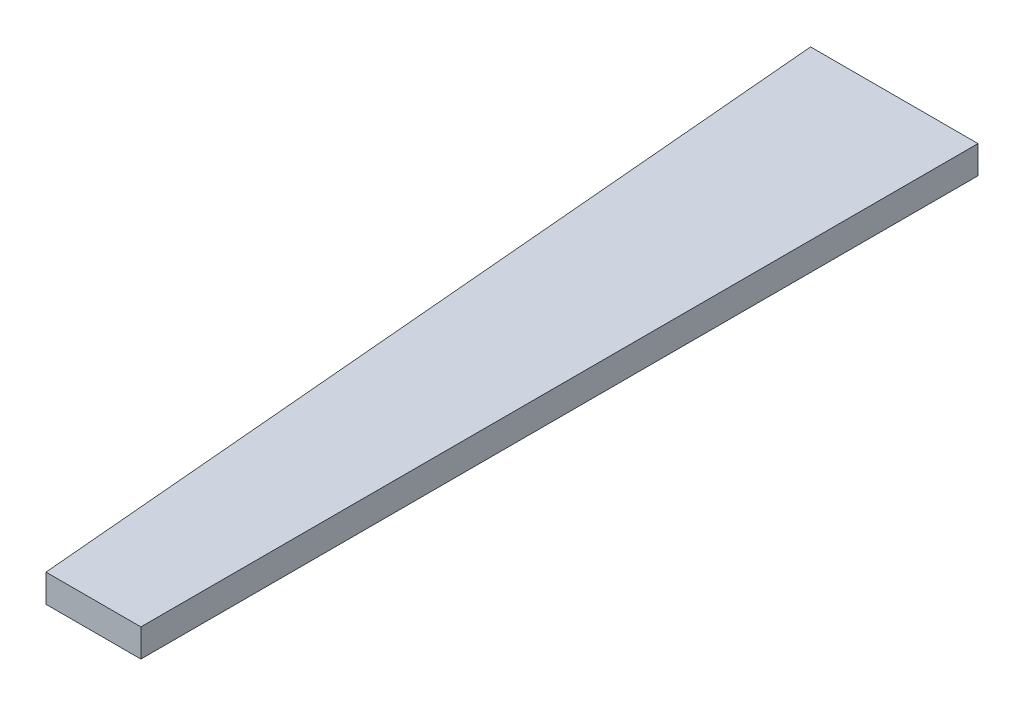
ISO-10303-21;
HEADER;
FILE_DESCRIPTION(('STEP AP214'),'2;1');
FILE_NAME('part.step','',(''),(''),'','','');
FILE_SCHEMA(('AUTOMOTIVE_DESIGN { 1 0 10303 214 1 1 1 1 }'));
ENDSEC;
DATA;
#1=APPLICATION_CONTEXT('core data for automotive mechanical design processes');
#2=APPLICATION_PROTOCOL_DEFINITION('international standard','automotive_design',2000,#1);
#3=PRODUCT_CONTEXT('',#1,'mechanical');
#4=PRODUCT('Part','Part','',(#3));
#5=PRODUCT_RELATED_PRODUCT_CATEGORY('part','',(#4));
#6=PRODUCT_DEFINITION_FORMATION('','',#4);
#7=PRODUCT_DEFINITION_CONTEXT('part definition',#1,'design');
#8=PRODUCT_DEFINITION('design','',#6,#7);
#9=PRODUCT_DEFINITION_SHAPE('','',#8);
#10=(LENGTH_UNIT() NAMED_UNIT(*) SI_UNIT(.MILLI.,.METRE.));
#11=(NAMED_UNIT(*) PLANE_ANGLE_UNIT() SI_UNIT($,.RADIAN.));
#12=(NAMED_UNIT(*) SI_UNIT($,.STERADIAN.) SOLID_ANGLE_UNIT());
#13=UNCERTAINTY_MEASURE_WITH_UNIT(LENGTH_MEASURE(1.E-05),#10,'distance_accuracy_value','');
#14=(GEOMETRIC_REPRESENTATION_CONTEXT(3) GLOBAL_UNCERTAINTY_ASSIGNED_CONTEXT((#13)) GLOBAL_UNIT_ASSIGNED_CONTEXT((#10,
#11,#12)) REPRESENTATION_CONTEXT('',''));
#15=CARTESIAN_POINT('',(0.,0.,0.));
#16=DIRECTION('',(0.,0.,1.));
#17=DIRECTION('',(1.,0.,0.));
#18=AXIS2_PLACEMENT_3D('',#15,#16,#17);
#19=CARTESIAN_POINT('',(-33.02,12.7,-381.));
#20=DIRECTION('',(0.996265469182466,0.,-0.0863430073291471));
#21=DIRECTION('',(-0.0863430073291471,0.,-0.996265469182466));
#22=AXIS2_PLACEMENT_3D('',#19,#20,#21);
#23=PLANE('',#22);
#24=DIRECTION('',(0.0863430073291471,0.,0.996265469182466));
#25=VECTOR('',#24,1.);
#26=CARTESIAN_POINT('',(-33.02,0.,-381.));
#27=LINE('',#26,#25);
#28=CARTESIAN_POINT('',(-33.02,0.,-381.));
#29=VERTEX_POINT('',#28);
#30=CARTESIAN_POINT('',(0.,0.,0.));
#31=VERTEX_POINT('',#30);
#32=EDGE_CURVE('E102',#29,#31,#27,.T.);
#33=ORIENTED_EDGE('',*,*,#32,.T.);
#34=DIRECTION('',(0.,-1.,0.));
#35=VECTOR('',#34,1.);
#36=CARTESIAN_POINT('',(0.,12.7,0.));
#37=LINE('',#36,#35);
#38=CARTESIAN_POINT('',(0.,12.7,0.));
#39=VERTEX_POINT('',#38);
#40=EDGE_CURVE('E11',#39,#31,#37,.T.);
#41=ORIENTED_EDGE('',*,*,#40,.F.);
#42=DIRECTION('',(0.0863430073291471,0.,0.996265469182466));
#43=VECTOR('',#42,1.);
#44=CARTESIAN_POINT('',(-33.02,12.7,-381.));
#45=LINE('',#44,#43);
#46=CARTESIAN_POINT('',(-33.02,12.7,-381.));
#47=VERTEX_POINT('',#46);
#48=EDGE_CURVE('E90',#47,#39,#45,.T.);
#49=ORIENTED_EDGE('',*,*,#48,.F.);
#50=DIRECTION('',(0.,-1.,0.));
#51=VECTOR('',#50,1.);
#52=CARTESIAN_POINT('',(-33.02,12.7,-381.));
#53=LINE('',#52,#51);
#54=EDGE_CURVE('E98',#47,#29,#53,.T.);
#55=ORIENTED_EDGE('',*,*,#54,.T.);
#56=EDGE_LOOP('',(#33,#41,#49,#55));
#57=FACE_BOUND('',#56,.T.);
#58=ADVANCED_FACE('F39',(#57),#23,.F.);
#59=CARTESIAN_POINT('',(0.,12.7,0.));
#60=DIRECTION('',(0.,0.,-1.));
#61=DIRECTION('',(-1.,0.,0.));
#62=AXIS2_PLACEMENT_3D('',#59,#60,#61);
#63=PLANE('',#62);
#64=DIRECTION('',(1.,0.,0.));
#65=VECTOR('',#64,1.);
#66=CARTESIAN_POINT('',(0.,0.,0.));
#67=LINE('',#66,#65);
#68=CARTESIAN_POINT('',(43.18,0.,0.));
#69=VERTEX_POINT('',#68);
#70=EDGE_CURVE('E94',#31,#69,#67,.T.);
#71=ORIENTED_EDGE('',*,*,#70,.T.);
#72=DIRECTION('',(0.,-1.,0.));
#73=VECTOR('',#72,1.);
#74=CARTESIAN_POINT('',(43.18,12.7,0.));
#75=LINE('',#74,#73);
#76=CARTESIAN_POINT('',(43.18,12.7,0.));
#77=VERTEX_POINT('',#76);
#78=EDGE_CURVE('E47',#77,#69,#75,.T.);
#79=ORIENTED_EDGE('',*,*,#78,.F.);
#80=DIRECTION('',(1.,0.,0.));
#81=VECTOR('',#80,1.);
#82=CARTESIAN_POINT('',(0.,12.7,0.));
#83=LINE('',#82,#81);
#84=EDGE_CURVE('E85',#39,#77,#83,.T.);
#85=ORIENTED_EDGE('',*,*,#84,.F.);
#86=ORIENTED_EDGE('',*,*,#40,.T.);
#87=EDGE_LOOP('',(#71,#79,#85,#86));
#88=FACE_BOUND('',#87,.T.);
#89=ADVANCED_FACE('F93',(#88),#63,.F.);
#90=CARTESIAN_POINT('',(43.18,12.7,0.));
#91=DIRECTION('',(-1.,0.,0.));
#92=DIRECTION('',(0.,0.,1.));
#93=AXIS2_PLACEMENT_3D('',#90,#91,#92);
#94=PLANE('',#93);
#95=DIRECTION('',(0.,0.,-1.));
#96=VECTOR('',#95,1.);
#97=CARTESIAN_POINT('',(43.18,0.,0.));
#98=LINE('',#97,#96);
#99=CARTESIAN_POINT('',(43.18,0.,-381.));
#100=VERTEX_POINT('',#99);
#101=EDGE_CURVE('E72',#69,#100,#98,.T.);
#102=ORIENTED_EDGE('',*,*,#101,.T.);
#103=DIRECTION('',(0.,-1.,0.));
#104=VECTOR('',#103,1.);
#105=CARTESIAN_POINT('',(43.18,12.7,-381.));
#106=LINE('',#105,#104);
#107=CARTESIAN_POINT('',(43.18,12.7,-381.));
#108=VERTEX_POINT('',#107);
#109=EDGE_CURVE('E95',#108,#100,#106,.T.);
#110=ORIENTED_EDGE('',*,*,#109,.F.);
#111=DIRECTION('',(0.,0.,-1.));
#112=VECTOR('',#111,1.);
#113=CARTESIAN_POINT('',(43.18,12.7,0.));
#114=LINE('',#113,#112);
#115=EDGE_CURVE('E88',#77,#108,#114,.T.);
#116=ORIENTED_EDGE('',*,*,#115,.F.);
#117=ORIENTED_EDGE('',*,*,#78,.T.);
#118=EDGE_LOOP('',(#102,#110,#116,#117));
#119=FACE_BOUND('',#118,.T.);
#120=ADVANCED_FACE('F96',(#119),#94,.F.);
#121=CARTESIAN_POINT('',(43.18,12.7,-381.));
#122=DIRECTION('',(0.,0.,1.));
#123=DIRECTION('',(1.,0.,0.));
#124=AXIS2_PLACEMENT_3D('',#121,#122,#123);
#125=PLANE('',#124);
#126=DIRECTION('',(-1.,0.,0.));
#127=VECTOR('',#126,1.);
#128=CARTESIAN_POINT('',(43.18,0.,-381.));
#129=LINE('',#128,#127);
#130=EDGE_CURVE('E78',#100,#29,#129,.T.);
#131=ORIENTED_EDGE('',*,*,#130,.T.);
#132=ORIENTED_EDGE('',*,*,#54,.F.);
#133=DIRECTION('',(-1.,0.,0.));
#134=VECTOR('',#133,1.);
#135=CARTESIAN_POINT('',(43.18,12.7,-381.));
#136=LINE('',#135,#134);
#137=EDGE_CURVE('E55',#108,#47,#136,.T.);
#138=ORIENTED_EDGE('',*,*,#137,.F.);
#139=ORIENTED_EDGE('',*,*,#109,.T.);
#140=EDGE_LOOP('',(#131,#132,#138,#139));
#141=FACE_BOUND('',#140,.T.);
#142=ADVANCED_FACE('F109',(#141),#125,.F.);
#143=CARTESIAN_POINT('',(0.,12.7,0.));
#144=DIRECTION('',(0.,1.,0.));
#145=DIRECTION('',(0.,0.,1.));
#146=AXIS2_PLACEMENT_3D('',#143,#144,#145);
#147=PLANE('',#146);
#148=ORIENTED_EDGE('',*,*,#48,.T.);
#149=ORIENTED_EDGE('',*,*,#84,.T.);
#150=ORIENTED_EDGE('',*,*,#115,.T.);
#151=ORIENTED_EDGE('',*,*,#137,.T.);
#152=EDGE_LOOP('',(#148,#149,#150,#151));
#153=FACE_BOUND('',#152,.T.);
#154=ADVANCED_FACE('F86',(#153),#147,.T.);
#155=CARTESIAN_POINT('',(0.,0.,0.));
#156=DIRECTION('',(0.,1.,0.));
#157=DIRECTION('',(0.,0.,1.));
#158=AXIS2_PLACEMENT_3D('',#155,#156,#157);
#159=PLANE('',#158);
#160=ORIENTED_EDGE('',*,*,#32,.F.);
#161=ORIENTED_EDGE('',*,*,#130,.F.);
#162=ORIENTED_EDGE('',*,*,#101,.F.);
#163=ORIENTED_EDGE('',*,*,#70,.F.);
#164=EDGE_LOOP('',(#160,#161,#162,#163));
#165=FACE_BOUND('',#164,.T.);
#166=ADVANCED_FACE('F112',(#165),#159,.F.);
#167=CLOSED_SHELL('',(#58,#89,#120,#142,#154,#166));
#168=MANIFOLD_SOLID_BREP('B2',#167);
#169=ADVANCED_BREP_SHAPE_REPRESENTATION('',(#18,#168),#14);
#170=SHAPE_DEFINITION_REPRESENTATION(#9,#169);
ENDSEC;
END-ISO-10303-21;
